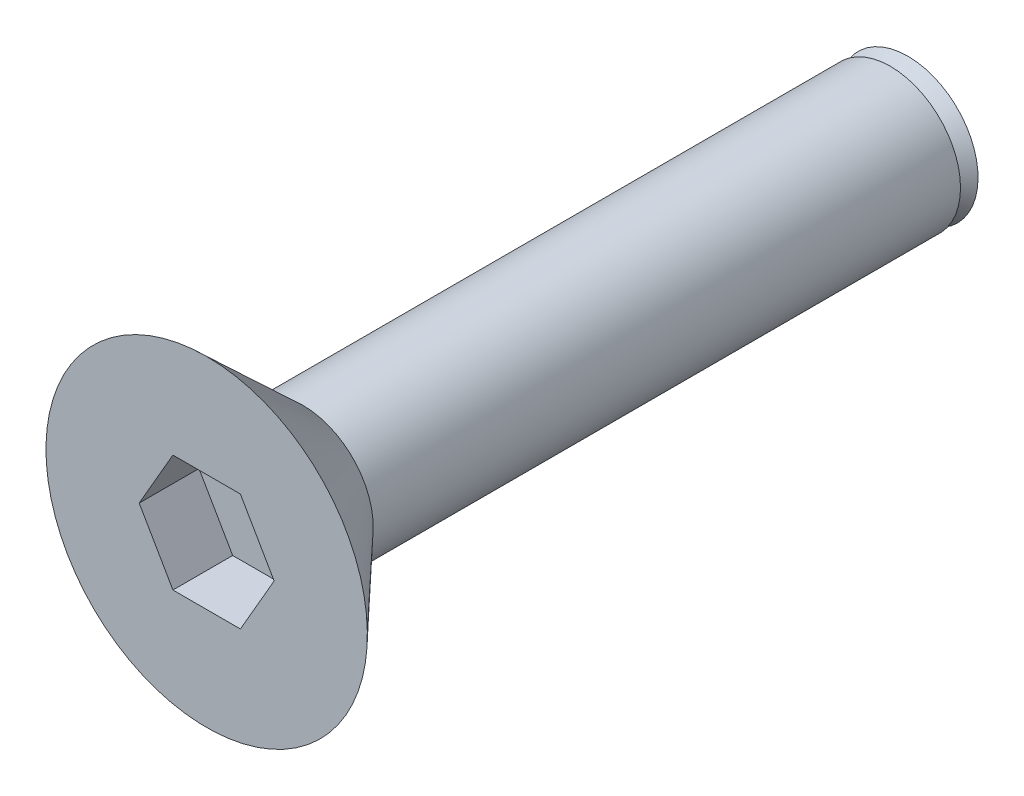
ISO-10303-21;
HEADER;
FILE_DESCRIPTION(('STEP AP214'),'2;1');
FILE_NAME('part.step','',(''),(''),'','','');
FILE_SCHEMA(('AUTOMOTIVE_DESIGN { 1 0 10303 214 1 1 1 1 }'));
ENDSEC;
DATA;
#1=APPLICATION_CONTEXT('core data for automotive mechanical design processes');
#2=APPLICATION_PROTOCOL_DEFINITION('international standard','automotive_design',2000,#1);
#3=PRODUCT_CONTEXT('',#1,'mechanical');
#4=PRODUCT('Part','Part','',(#3));
#5=PRODUCT_RELATED_PRODUCT_CATEGORY('part','',(#4));
#6=PRODUCT_DEFINITION_FORMATION('','',#4);
#7=PRODUCT_DEFINITION_CONTEXT('part definition',#1,'design');
#8=PRODUCT_DEFINITION('design','',#6,#7);
#9=PRODUCT_DEFINITION_SHAPE('','',#8);
#10=(LENGTH_UNIT() NAMED_UNIT(*) SI_UNIT(.MILLI.,.METRE.));
#11=(NAMED_UNIT(*) PLANE_ANGLE_UNIT() SI_UNIT($,.RADIAN.));
#12=(NAMED_UNIT(*) SI_UNIT($,.STERADIAN.) SOLID_ANGLE_UNIT());
#13=UNCERTAINTY_MEASURE_WITH_UNIT(LENGTH_MEASURE(1.E-05),#10,'distance_accuracy_value','');
#14=(GEOMETRIC_REPRESENTATION_CONTEXT(3) GLOBAL_UNCERTAINTY_ASSIGNED_CONTEXT((#13)) GLOBAL_UNIT_ASSIGNED_CONTEXT((#10,
#11,#12)) REPRESENTATION_CONTEXT('',''));
#15=CARTESIAN_POINT('',(0.,0.,0.));
#16=DIRECTION('',(0.,0.,1.));
#17=DIRECTION('',(1.,0.,0.));
#18=AXIS2_PLACEMENT_3D('',#15,#16,#17);
#19=CARTESIAN_POINT('',(2.75,0.,0.));
#20=DIRECTION('',(0.,0.,1.));
#21=DIRECTION('',(0.,-1.,0.));
#22=AXIS2_PLACEMENT_3D('',#19,#20,#21);
#23=PLANE('',#22);
#24=CARTESIAN_POINT('',(0.,0.,0.));
#25=DIRECTION('',(0.,0.,-1.));
#26=DIRECTION('',(0.,1.,0.));
#27=AXIS2_PLACEMENT_3D('',#24,#25,#26);
#28=CIRCLE('',#27,2.75);
#29=CARTESIAN_POINT('',(0.,2.75,0.));
#30=VERTEX_POINT('',#29);
#31=EDGE_CURVE('E136',#30,#30,#28,.T.);
#32=ORIENTED_EDGE('',*,*,#31,.F.);
#33=EDGE_LOOP('',(#32));
#34=FACE_BOUND('',#33,.T.);
#35=DIRECTION('',(0.5,-0.866025403784439,0.));
#36=VECTOR('',#35,1.);
#37=CARTESIAN_POINT('',(1.55352540378444,-0.690784930203603,0.));
#38=LINE('',#37,#36);
#39=CARTESIAN_POINT('',(0.577350269189626,1.,0.));
#40=VERTEX_POINT('',#39);
#41=CARTESIAN_POINT('',(1.15470053837925,0.,0.));
#42=VERTEX_POINT('',#41);
#43=EDGE_CURVE('E51',#40,#42,#38,.T.);
#44=ORIENTED_EDGE('',*,*,#43,.T.);
#45=DIRECTION('',(-0.5,-0.866025403784439,0.));
#46=VECTOR('',#45,1.);
#47=CARTESIAN_POINT('',(1.55352540378444,0.690784930203603,0.));
#48=LINE('',#47,#46);
#49=CARTESIAN_POINT('',(0.577350269189626,-1.,0.));
#50=VERTEX_POINT('',#49);
#51=EDGE_CURVE('E11',#42,#50,#48,.T.);
#52=ORIENTED_EDGE('',*,*,#51,.T.);
#53=DIRECTION('',(-1.,0.,0.));
#54=VECTOR('',#53,1.);
#55=CARTESIAN_POINT('',(2.75,-1.,0.));
#56=LINE('',#55,#54);
#57=CARTESIAN_POINT('',(-0.577350269189626,-1.,0.));
#58=VERTEX_POINT('',#57);
#59=EDGE_CURVE('E147',#50,#58,#56,.T.);
#60=ORIENTED_EDGE('',*,*,#59,.T.);
#61=DIRECTION('',(-0.5,0.866025403784439,0.));
#62=VECTOR('',#61,1.);
#63=CARTESIAN_POINT('',(-0.17852540378444,-1.6907849302036,0.));
#64=LINE('',#63,#62);
#65=CARTESIAN_POINT('',(-1.15470053837925,0.,0.));
#66=VERTEX_POINT('',#65);
#67=EDGE_CURVE('E150',#58,#66,#64,.T.);
#68=ORIENTED_EDGE('',*,*,#67,.T.);
#69=DIRECTION('',(0.5,0.866025403784438,0.));
#70=VECTOR('',#69,1.);
#71=CARTESIAN_POINT('',(-0.178525403784437,1.6907849302036,0.));
#72=LINE('',#71,#70);
#73=CARTESIAN_POINT('',(-0.577350269189625,0.999999999999999,0.));
#74=VERTEX_POINT('',#73);
#75=EDGE_CURVE('E153',#66,#74,#72,.T.);
#76=ORIENTED_EDGE('',*,*,#75,.T.);
#77=DIRECTION('',(1.,0.,0.));
#78=VECTOR('',#77,1.);
#79=CARTESIAN_POINT('',(2.75,1.,0.));
#80=LINE('',#79,#78);
#81=EDGE_CURVE('E156',#74,#40,#80,.T.);
#82=ORIENTED_EDGE('',*,*,#81,.T.);
#83=EDGE_LOOP('',(#44,#52,#60,#68,#76,#82));
#84=FACE_BOUND('',#83,.T.);
#85=ADVANCED_FACE('F43',(#34,#84),#23,.T.);
#86=CARTESIAN_POINT('',(0.,0.,-1.65));
#87=DIRECTION('',(0.,0.,1.));
#88=DIRECTION('',(0.,-1.,0.));
#89=AXIS2_PLACEMENT_3D('',#86,#87,#88);
#90=CONICAL_SURFACE('',#89,1.2,0.75415832996718);
#91=ORIENTED_EDGE('',*,*,#31,.T.);
#92=EDGE_LOOP('',(#91));
#93=FACE_BOUND('',#92,.T.);
#94=CARTESIAN_POINT('',(0.,0.,-1.65));
#95=DIRECTION('',(0.,0.,-1.));
#96=DIRECTION('',(0.,1.,0.));
#97=AXIS2_PLACEMENT_3D('',#94,#95,#96);
#98=CIRCLE('',#97,1.2);
#99=CARTESIAN_POINT('',(0.,1.2,-1.65));
#100=VERTEX_POINT('',#99);
#101=EDGE_CURVE('E144',#100,#100,#98,.T.);
#102=ORIENTED_EDGE('',*,*,#101,.F.);
#103=EDGE_LOOP('',(#102));
#104=FACE_BOUND('',#103,.T.);
#105=ADVANCED_FACE('F45',(#93,#104),#90,.T.);
#106=CARTESIAN_POINT('',(0.,0.,-1.65));
#107=DIRECTION('',(0.,0.,-1.));
#108=DIRECTION('',(-1.,0.,0.));
#109=AXIS2_PLACEMENT_3D('',#106,#107,#108);
#110=CYLINDRICAL_SURFACE('',#109,1.2);
#111=ORIENTED_EDGE('',*,*,#101,.T.);
#112=EDGE_LOOP('',(#111));
#113=FACE_BOUND('',#112,.T.);
#114=CARTESIAN_POINT('',(0.,0.,-11.7));
#115=DIRECTION('',(0.,0.,1.));
#116=DIRECTION('',(1.,0.,0.));
#117=AXIS2_PLACEMENT_3D('',#114,#115,#116);
#118=CIRCLE('',#117,1.2);
#119=CARTESIAN_POINT('',(1.2,0.,-11.7));
#120=VERTEX_POINT('',#119);
#121=EDGE_CURVE('E137',#120,#120,#118,.T.);
#122=ORIENTED_EDGE('',*,*,#121,.T.);
#123=EDGE_LOOP('',(#122));
#124=FACE_BOUND('',#123,.T.);
#125=ADVANCED_FACE('F183',(#113,#124),#110,.T.);
#126=CARTESIAN_POINT('',(0.,0.,-11.7));
#127=DIRECTION('',(0.,0.,1.));
#128=DIRECTION('',(1.,0.,0.));
#129=AXIS2_PLACEMENT_3D('',#126,#127,#128);
#130=PLANE('',#129);
#131=CARTESIAN_POINT('',(0.,0.,-11.7));
#132=DIRECTION('',(0.,0.,-1.));
#133=DIRECTION('',(0.,1.,0.));
#134=AXIS2_PLACEMENT_3D('',#131,#132,#133);
#135=CIRCLE('',#134,0.9);
#136=CARTESIAN_POINT('',(0.,0.9,-11.7));
#137=VERTEX_POINT('',#136);
#138=EDGE_CURVE('E133',#137,#137,#135,.T.);
#139=ORIENTED_EDGE('',*,*,#138,.F.);
#140=EDGE_LOOP('',(#139));
#141=FACE_BOUND('',#140,.T.);
#142=ORIENTED_EDGE('',*,*,#121,.F.);
#143=EDGE_LOOP('',(#142));
#144=FACE_BOUND('',#143,.T.);
#145=ADVANCED_FACE('F189',(#141,#144),#130,.F.);
#146=CARTESIAN_POINT('',(0.,0.,-12.));
#147=DIRECTION('',(0.,0.,-1.));
#148=DIRECTION('',(0.,1.,0.));
#149=AXIS2_PLACEMENT_3D('',#146,#147,#148);
#150=PLANE('',#149);
#151=CARTESIAN_POINT('',(0.,0.,-12.));
#152=DIRECTION('',(0.,0.,-1.));
#153=DIRECTION('',(0.,1.,0.));
#154=AXIS2_PLACEMENT_3D('',#151,#152,#153);
#155=CIRCLE('',#154,1.2);
#156=CARTESIAN_POINT('',(0.,1.2,-12.));
#157=VERTEX_POINT('',#156);
#158=EDGE_CURVE('E100',#157,#157,#155,.T.);
#159=ORIENTED_EDGE('',*,*,#158,.T.);
#160=EDGE_LOOP('',(#159));
#161=FACE_BOUND('',#160,.T.);
#162=ADVANCED_FACE('F193',(#161),#150,.T.);
#163=CARTESIAN_POINT('',(0.,0.,-12.));
#164=DIRECTION('',(0.,0.,-1.));
#165=DIRECTION('',(0.,1.,0.));
#166=AXIS2_PLACEMENT_3D('',#163,#164,#165);
#167=CONICAL_SURFACE('',#166,1.2,0.785398163397457);
#168=ORIENTED_EDGE('',*,*,#138,.T.);
#169=EDGE_LOOP('',(#168));
#170=FACE_BOUND('',#169,.T.);
#171=ORIENTED_EDGE('',*,*,#158,.F.);
#172=EDGE_LOOP('',(#171));
#173=FACE_BOUND('',#172,.T.);
#174=ADVANCED_FACE('F197',(#170,#173),#167,.T.);
#175=CARTESIAN_POINT('',(0.577350269189626,-1.,0.00999999999999981));
#176=DIRECTION('',(-0.866025403784439,0.5,0.));
#177=DIRECTION('',(-0.5,-0.866025403784439,0.));
#178=AXIS2_PLACEMENT_3D('',#175,#176,#177);
#179=PLANE('',#178);
#180=DIRECTION('',(0.,0.,-1.));
#181=VECTOR('',#180,1.);
#182=CARTESIAN_POINT('',(1.15470053837925,0.,0.00999999999999981));
#183=LINE('',#182,#181);
#184=CARTESIAN_POINT('',(1.15470053837925,0.,-1.023));
#185=VERTEX_POINT('',#184);
#186=EDGE_CURVE('E93',#42,#185,#183,.T.);
#187=ORIENTED_EDGE('',*,*,#186,.T.);
#188=DIRECTION('',(0.5,0.866025403784439,0.));
#189=VECTOR('',#188,1.);
#190=CARTESIAN_POINT('',(0.577350269189626,-1.,-1.023));
#191=LINE('',#190,#189);
#192=CARTESIAN_POINT('',(0.577350269189626,-1.,-1.023));
#193=VERTEX_POINT('',#192);
#194=EDGE_CURVE('E97',#193,#185,#191,.T.);
#195=ORIENTED_EDGE('',*,*,#194,.F.);
#196=DIRECTION('',(0.,0.,-1.));
#197=VECTOR('',#196,1.);
#198=CARTESIAN_POINT('',(0.577350269189626,-1.,0.00999999999999981));
#199=LINE('',#198,#197);
#200=EDGE_CURVE('E125',#50,#193,#199,.T.);
#201=ORIENTED_EDGE('',*,*,#200,.F.);
#202=ORIENTED_EDGE('',*,*,#51,.F.);
#203=EDGE_LOOP('',(#187,#195,#201,#202));
#204=FACE_BOUND('',#203,.T.);
#205=ADVANCED_FACE('F95',(#204),#179,.T.);
#206=CARTESIAN_POINT('',(1.15470053837925,0.,0.00999999999999981));
#207=DIRECTION('',(-0.866025403784439,-0.5,0.));
#208=DIRECTION('',(0.,0.,1.));
#209=AXIS2_PLACEMENT_3D('',#206,#207,#208);
#210=PLANE('',#209);
#211=DIRECTION('',(0.,0.,-1.));
#212=VECTOR('',#211,1.);
#213=CARTESIAN_POINT('',(0.577350269189626,1.,0.00999999999999981));
#214=LINE('',#213,#212);
#215=CARTESIAN_POINT('',(0.577350269189626,1.,-1.023));
#216=VERTEX_POINT('',#215);
#217=EDGE_CURVE('E101',#40,#216,#214,.T.);
#218=ORIENTED_EDGE('',*,*,#217,.T.);
#219=DIRECTION('',(-0.5,0.866025403784439,0.));
#220=VECTOR('',#219,1.);
#221=CARTESIAN_POINT('',(1.15470053837925,0.,-1.023));
#222=LINE('',#221,#220);
#223=EDGE_CURVE('E104',#185,#216,#222,.T.);
#224=ORIENTED_EDGE('',*,*,#223,.F.);
#225=ORIENTED_EDGE('',*,*,#186,.F.);
#226=ORIENTED_EDGE('',*,*,#43,.F.);
#227=EDGE_LOOP('',(#218,#224,#225,#226));
#228=FACE_BOUND('',#227,.T.);
#229=ADVANCED_FACE('F105',(#228),#210,.T.);
#230=CARTESIAN_POINT('',(0.577350269189626,1.,0.00999999999999981));
#231=DIRECTION('',(0.,-1.,0.));
#232=DIRECTION('',(1.,0.,0.));
#233=AXIS2_PLACEMENT_3D('',#230,#231,#232);
#234=PLANE('',#233);
#235=DIRECTION('',(0.,0.,-1.));
#236=VECTOR('',#235,1.);
#237=CARTESIAN_POINT('',(-0.577350269189625,0.999999999999999,0.00999999999999981));
#238=LINE('',#237,#236);
#239=CARTESIAN_POINT('',(-0.577350269189625,0.999999999999999,-1.023));
#240=VERTEX_POINT('',#239);
#241=EDGE_CURVE('E130',#74,#240,#238,.T.);
#242=ORIENTED_EDGE('',*,*,#241,.T.);
#243=DIRECTION('',(-1.,0.,0.));
#244=VECTOR('',#243,1.);
#245=CARTESIAN_POINT('',(0.577350269189626,1.,-1.023));
#246=LINE('',#245,#244);
#247=EDGE_CURVE('E110',#216,#240,#246,.T.);
#248=ORIENTED_EDGE('',*,*,#247,.F.);
#249=ORIENTED_EDGE('',*,*,#217,.F.);
#250=ORIENTED_EDGE('',*,*,#81,.F.);
#251=EDGE_LOOP('',(#242,#248,#249,#250));
#252=FACE_BOUND('',#251,.T.);
#253=ADVANCED_FACE('F160',(#252),#234,.T.);
#254=CARTESIAN_POINT('',(-0.577350269189625,0.999999999999999,0.00999999999999981));
#255=DIRECTION('',(0.866025403784439,-0.5,0.));
#256=DIRECTION('',(0.5,0.866025403784439,0.));
#257=AXIS2_PLACEMENT_3D('',#254,#255,#256);
#258=PLANE('',#257);
#259=DIRECTION('',(0.,0.,-1.));
#260=VECTOR('',#259,1.);
#261=CARTESIAN_POINT('',(-1.15470053837925,0.,0.00999999999999981));
#262=LINE('',#261,#260);
#263=CARTESIAN_POINT('',(-1.15470053837925,0.,-1.023));
#264=VERTEX_POINT('',#263);
#265=EDGE_CURVE('E128',#66,#264,#262,.T.);
#266=ORIENTED_EDGE('',*,*,#265,.T.);
#267=DIRECTION('',(-0.5,-0.866025403784439,0.));
#268=VECTOR('',#267,1.);
#269=CARTESIAN_POINT('',(-0.577350269189625,0.999999999999999,-1.023));
#270=LINE('',#269,#268);
#271=EDGE_CURVE('E119',#240,#264,#270,.T.);
#272=ORIENTED_EDGE('',*,*,#271,.F.);
#273=ORIENTED_EDGE('',*,*,#241,.F.);
#274=ORIENTED_EDGE('',*,*,#75,.F.);
#275=EDGE_LOOP('',(#266,#272,#273,#274));
#276=FACE_BOUND('',#275,.T.);
#277=ADVANCED_FACE('F165',(#276),#258,.T.);
#278=CARTESIAN_POINT('',(-1.15470053837925,0.,0.00999999999999981));
#279=DIRECTION('',(0.866025403784439,0.5,0.));
#280=DIRECTION('',(-0.5,0.866025403784439,0.));
#281=AXIS2_PLACEMENT_3D('',#278,#279,#280);
#282=PLANE('',#281);
#283=DIRECTION('',(0.,0.,-1.));
#284=VECTOR('',#283,1.);
#285=CARTESIAN_POINT('',(-0.577350269189626,-1.,0.00999999999999981));
#286=LINE('',#285,#284);
#287=CARTESIAN_POINT('',(-0.577350269189626,-1.,-1.023));
#288=VERTEX_POINT('',#287);
#289=EDGE_CURVE('E58',#58,#288,#286,.T.);
#290=ORIENTED_EDGE('',*,*,#289,.T.);
#291=DIRECTION('',(0.5,-0.866025403784439,0.));
#292=VECTOR('',#291,1.);
#293=CARTESIAN_POINT('',(-1.15470053837925,0.,-1.023));
#294=LINE('',#293,#292);
#295=EDGE_CURVE('E122',#264,#288,#294,.T.);
#296=ORIENTED_EDGE('',*,*,#295,.F.);
#297=ORIENTED_EDGE('',*,*,#265,.F.);
#298=ORIENTED_EDGE('',*,*,#67,.F.);
#299=EDGE_LOOP('',(#290,#296,#297,#298));
#300=FACE_BOUND('',#299,.T.);
#301=ADVANCED_FACE('F168',(#300),#282,.T.);
#302=CARTESIAN_POINT('',(-0.577350269189626,-1.,0.00999999999999981));
#303=DIRECTION('',(0.,1.,0.));
#304=DIRECTION('',(-1.,0.,0.));
#305=AXIS2_PLACEMENT_3D('',#302,#303,#304);
#306=PLANE('',#305);
#307=ORIENTED_EDGE('',*,*,#200,.T.);
#308=DIRECTION('',(1.,0.,0.));
#309=VECTOR('',#308,1.);
#310=CARTESIAN_POINT('',(-0.577350269189626,-1.,-1.023));
#311=LINE('',#310,#309);
#312=EDGE_CURVE('E115',#288,#193,#311,.T.);
#313=ORIENTED_EDGE('',*,*,#312,.F.);
#314=ORIENTED_EDGE('',*,*,#289,.F.);
#315=ORIENTED_EDGE('',*,*,#59,.F.);
#316=EDGE_LOOP('',(#307,#313,#314,#315));
#317=FACE_BOUND('',#316,.T.);
#318=ADVANCED_FACE('F169',(#317),#306,.T.);
#319=CARTESIAN_POINT('',(1.15470053837925,0.,-1.023));
#320=DIRECTION('',(0.,0.,1.));
#321=DIRECTION('',(-0.5,0.866025403784439,0.));
#322=AXIS2_PLACEMENT_3D('',#319,#320,#321);
#323=PLANE('',#322);
#324=ORIENTED_EDGE('',*,*,#194,.T.);
#325=ORIENTED_EDGE('',*,*,#223,.T.);
#326=ORIENTED_EDGE('',*,*,#247,.T.);
#327=ORIENTED_EDGE('',*,*,#271,.T.);
#328=ORIENTED_EDGE('',*,*,#295,.T.);
#329=ORIENTED_EDGE('',*,*,#312,.T.);
#330=EDGE_LOOP('',(#324,#325,#326,#327,#328,#329));
#331=FACE_BOUND('',#330,.T.);
#332=ADVANCED_FACE('F113',(#331),#323,.T.);
#333=CLOSED_SHELL('',(#85,#105,#125,#145,#162,#174,#205,#229,#253,#277,#301,#318,#332));
#334=MANIFOLD_SOLID_BREP('B2',#333);
#335=ADVANCED_BREP_SHAPE_REPRESENTATION('',(#18,#334),#14);
#336=SHAPE_DEFINITION_REPRESENTATION(#9,#335);
ENDSEC;
END-ISO-10303-21;
